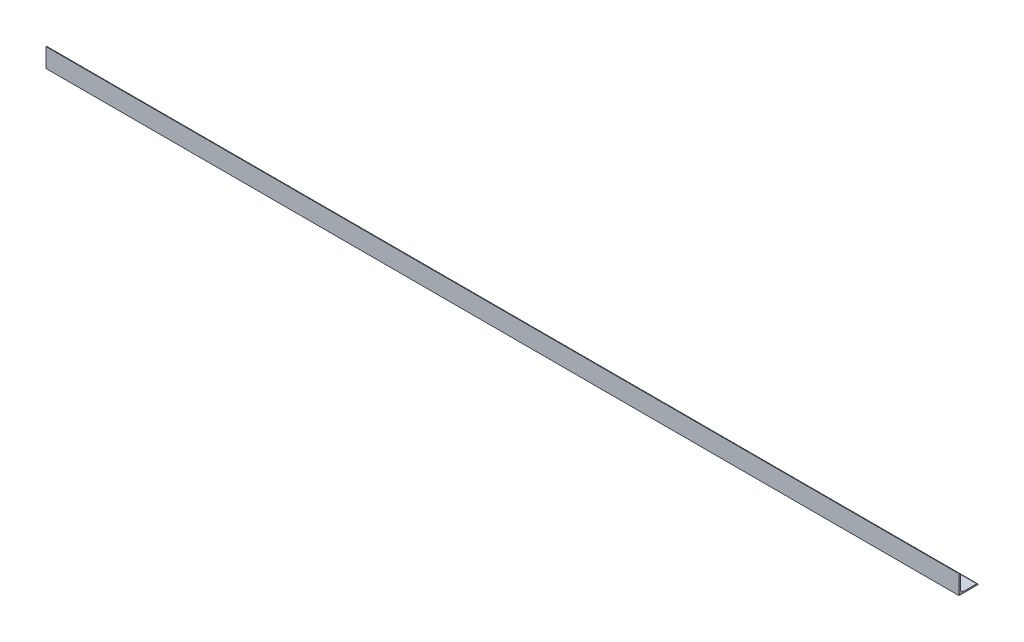
ISO-10303-21;
HEADER;
FILE_DESCRIPTION(('STEP AP214'),'2;1');
FILE_NAME('part.step','',(''),(''),'','','');
FILE_SCHEMA(('AUTOMOTIVE_DESIGN { 1 0 10303 214 1 1 1 1 }'));
ENDSEC;
DATA;
#1=APPLICATION_CONTEXT('core data for automotive mechanical design processes');
#2=APPLICATION_PROTOCOL_DEFINITION('international standard','automotive_design',2000,#1);
#3=PRODUCT_CONTEXT('',#1,'mechanical');
#4=PRODUCT('Part','Part','',(#3));
#5=PRODUCT_RELATED_PRODUCT_CATEGORY('part','',(#4));
#6=PRODUCT_DEFINITION_FORMATION('','',#4);
#7=PRODUCT_DEFINITION_CONTEXT('part definition',#1,'design');
#8=PRODUCT_DEFINITION('design','',#6,#7);
#9=PRODUCT_DEFINITION_SHAPE('','',#8);
#10=(LENGTH_UNIT() NAMED_UNIT(*) SI_UNIT(.MILLI.,.METRE.));
#11=(NAMED_UNIT(*) PLANE_ANGLE_UNIT() SI_UNIT($,.RADIAN.));
#12=(NAMED_UNIT(*) SI_UNIT($,.STERADIAN.) SOLID_ANGLE_UNIT());
#13=UNCERTAINTY_MEASURE_WITH_UNIT(LENGTH_MEASURE(1.E-05),#10,'distance_accuracy_value','');
#14=(GEOMETRIC_REPRESENTATION_CONTEXT(3) GLOBAL_UNCERTAINTY_ASSIGNED_CONTEXT((#13)) GLOBAL_UNIT_ASSIGNED_CONTEXT((#10,
#11,#12)) REPRESENTATION_CONTEXT('',''));
#15=CARTESIAN_POINT('',(0.,0.,0.));
#16=DIRECTION('',(0.,0.,1.));
#17=DIRECTION('',(1.,0.,0.));
#18=AXIS2_PLACEMENT_3D('',#15,#16,#17);
#19=CARTESIAN_POINT('',(1920.,0.,-40.));
#20=DIRECTION('',(0.,1.,0.));
#21=DIRECTION('',(0.,0.,1.));
#22=AXIS2_PLACEMENT_3D('',#19,#20,#21);
#23=PLANE('',#22);
#24=CARTESIAN_POINT('',(1450.,0.,-19.9999999999966));
#25=DIRECTION('',(0.,-1.,0.));
#26=DIRECTION('',(0.,0.,-1.));
#27=AXIS2_PLACEMENT_3D('',#24,#25,#26);
#28=CIRCLE('',#27,1.99999999999989);
#29=CARTESIAN_POINT('',(1450.,0.,-21.9999999999965));
#30=VERTEX_POINT('',#29);
#31=EDGE_CURVE('E208',#30,#30,#28,.T.);
#32=ORIENTED_EDGE('',*,*,#31,.F.);
#33=EDGE_LOOP('',(#32));
#34=FACE_BOUND('',#33,.T.);
#35=CARTESIAN_POINT('',(470.,0.,-20.));
#36=DIRECTION('',(0.,-1.,0.));
#37=DIRECTION('',(0.,0.,-1.));
#38=AXIS2_PLACEMENT_3D('',#35,#36,#37);
#39=CIRCLE('',#38,2.);
#40=CARTESIAN_POINT('',(470.,0.,-22.));
#41=VERTEX_POINT('',#40);
#42=EDGE_CURVE('E212',#41,#41,#39,.T.);
#43=ORIENTED_EDGE('',*,*,#42,.F.);
#44=EDGE_LOOP('',(#43));
#45=FACE_BOUND('',#44,.T.);
#46=CARTESIAN_POINT('',(960.,0.,-20.));
#47=DIRECTION('',(0.,-1.,0.));
#48=DIRECTION('',(0.,0.,-1.));
#49=AXIS2_PLACEMENT_3D('',#46,#47,#48);
#50=CIRCLE('',#49,2.);
#51=CARTESIAN_POINT('',(960.,0.,-22.));
#52=VERTEX_POINT('',#51);
#53=EDGE_CURVE('E178',#52,#52,#50,.T.);
#54=ORIENTED_EDGE('',*,*,#53,.F.);
#55=EDGE_LOOP('',(#54));
#56=FACE_BOUND('',#55,.T.);
#57=DIRECTION('',(0.,0.,-1.));
#58=VECTOR('',#57,1.);
#59=CARTESIAN_POINT('',(0.,0.,-40.));
#60=LINE('',#59,#58);
#61=CARTESIAN_POINT('',(0.,0.,0.));
#62=VERTEX_POINT('',#61);
#63=CARTESIAN_POINT('',(0.,0.,-40.));
#64=VERTEX_POINT('',#63);
#65=EDGE_CURVE('E154',#62,#64,#60,.T.);
#66=ORIENTED_EDGE('',*,*,#65,.T.);
#67=DIRECTION('',(-1.,0.,0.));
#68=VECTOR('',#67,1.);
#69=CARTESIAN_POINT('',(1920.,0.,-40.));
#70=LINE('',#69,#68);
#71=CARTESIAN_POINT('',(1920.,0.,-40.));
#72=VERTEX_POINT('',#71);
#73=EDGE_CURVE('E13',#72,#64,#70,.T.);
#74=ORIENTED_EDGE('',*,*,#73,.F.);
#75=DIRECTION('',(0.,0.,-1.));
#76=VECTOR('',#75,1.);
#77=CARTESIAN_POINT('',(1920.,0.,-40.));
#78=LINE('',#77,#76);
#79=CARTESIAN_POINT('',(1920.,0.,0.));
#80=VERTEX_POINT('',#79);
#81=EDGE_CURVE('E166',#80,#72,#78,.T.);
#82=ORIENTED_EDGE('',*,*,#81,.F.);
#83=DIRECTION('',(-1.,0.,0.));
#84=VECTOR('',#83,1.);
#85=CARTESIAN_POINT('',(1920.,0.,0.));
#86=LINE('',#85,#84);
#87=EDGE_CURVE('E150',#80,#62,#86,.T.);
#88=ORIENTED_EDGE('',*,*,#87,.T.);
#89=EDGE_LOOP('',(#66,#74,#82,#88));
#90=FACE_BOUND('',#89,.T.);
#91=ADVANCED_FACE('F62',(#34,#45,#56,#90),#23,.F.);
#92=CARTESIAN_POINT('',(1920.,0.,-37.));
#93=DIRECTION('',(-1.,0.,0.));
#94=DIRECTION('',(0.,0.,1.));
#95=AXIS2_PLACEMENT_3D('',#92,#93,#94);
#96=CYLINDRICAL_SURFACE('',#95,3.);
#97=CARTESIAN_POINT('',(0.,0.,-37.));
#98=DIRECTION('',(1.,0.,0.));
#99=DIRECTION('',(0.,0.,-1.));
#100=AXIS2_PLACEMENT_3D('',#97,#98,#99);
#101=CIRCLE('',#100,3.);
#102=CARTESIAN_POINT('',(0.,3.,-37.));
#103=VERTEX_POINT('',#102);
#104=EDGE_CURVE('E157',#64,#103,#101,.T.);
#105=ORIENTED_EDGE('',*,*,#104,.T.);
#106=DIRECTION('',(-1.,0.,0.));
#107=VECTOR('',#106,1.);
#108=CARTESIAN_POINT('',(1920.,3.,-37.));
#109=LINE('',#108,#107);
#110=CARTESIAN_POINT('',(1920.,3.,-37.));
#111=VERTEX_POINT('',#110);
#112=EDGE_CURVE('E71',#111,#103,#109,.T.);
#113=ORIENTED_EDGE('',*,*,#112,.F.);
#114=CARTESIAN_POINT('',(1920.,0.,-37.));
#115=DIRECTION('',(1.,0.,0.));
#116=DIRECTION('',(0.,0.,-1.));
#117=AXIS2_PLACEMENT_3D('',#114,#115,#116);
#118=CIRCLE('',#117,3.);
#119=EDGE_CURVE('E120',#72,#111,#118,.T.);
#120=ORIENTED_EDGE('',*,*,#119,.F.);
#121=ORIENTED_EDGE('',*,*,#73,.T.);
#122=EDGE_LOOP('',(#105,#113,#120,#121));
#123=FACE_BOUND('',#122,.T.);
#124=ADVANCED_FACE('F201',(#123),#96,.T.);
#125=CARTESIAN_POINT('',(1920.,3.,-9.));
#126=DIRECTION('',(0.,-1.,0.));
#127=DIRECTION('',(0.,0.,-1.));
#128=AXIS2_PLACEMENT_3D('',#125,#126,#127);
#129=PLANE('',#128);
#130=CARTESIAN_POINT('',(1450.,3.,-19.9999999999966));
#131=DIRECTION('',(0.,-1.,0.));
#132=DIRECTION('',(0.,0.,-1.));
#133=AXIS2_PLACEMENT_3D('',#130,#131,#132);
#134=CIRCLE('',#133,1.99999999999989);
#135=CARTESIAN_POINT('',(1450.,3.,-21.9999999999965));
#136=VERTEX_POINT('',#135);
#137=EDGE_CURVE('E65',#136,#136,#134,.T.);
#138=ORIENTED_EDGE('',*,*,#137,.T.);
#139=EDGE_LOOP('',(#138));
#140=FACE_BOUND('',#139,.T.);
#141=CARTESIAN_POINT('',(470.,3.,-20.));
#142=DIRECTION('',(0.,-1.,0.));
#143=DIRECTION('',(0.,0.,-1.));
#144=AXIS2_PLACEMENT_3D('',#141,#142,#143);
#145=CIRCLE('',#144,2.);
#146=CARTESIAN_POINT('',(470.,3.,-22.));
#147=VERTEX_POINT('',#146);
#148=EDGE_CURVE('E177',#147,#147,#145,.T.);
#149=ORIENTED_EDGE('',*,*,#148,.T.);
#150=EDGE_LOOP('',(#149));
#151=FACE_BOUND('',#150,.T.);
#152=CARTESIAN_POINT('',(960.,3.,-20.));
#153=DIRECTION('',(0.,-1.,0.));
#154=DIRECTION('',(0.,0.,-1.));
#155=AXIS2_PLACEMENT_3D('',#152,#153,#154);
#156=CIRCLE('',#155,2.);
#157=CARTESIAN_POINT('',(960.,3.,-22.));
#158=VERTEX_POINT('',#157);
#159=EDGE_CURVE('E175',#158,#158,#156,.T.);
#160=ORIENTED_EDGE('',*,*,#159,.T.);
#161=EDGE_LOOP('',(#160));
#162=FACE_BOUND('',#161,.T.);
#163=DIRECTION('',(0.,0.,1.));
#164=VECTOR('',#163,1.);
#165=CARTESIAN_POINT('',(0.,3.,-9.));
#166=LINE('',#165,#164);
#167=CARTESIAN_POINT('',(0.,3.,-9.00000000000001));
#168=VERTEX_POINT('',#167);
#169=EDGE_CURVE('E159',#103,#168,#166,.T.);
#170=ORIENTED_EDGE('',*,*,#169,.T.);
#171=DIRECTION('',(-1.,0.,0.));
#172=VECTOR('',#171,1.);
#173=CARTESIAN_POINT('',(1920.,3.,-9.00000000000001));
#174=LINE('',#173,#172);
#175=CARTESIAN_POINT('',(1920.,3.,-9.00000000000001));
#176=VERTEX_POINT('',#175);
#177=EDGE_CURVE('E170',#176,#168,#174,.T.);
#178=ORIENTED_EDGE('',*,*,#177,.F.);
#179=DIRECTION('',(0.,0.,1.));
#180=VECTOR('',#179,1.);
#181=CARTESIAN_POINT('',(1920.,3.,-9.));
#182=LINE('',#181,#180);
#183=EDGE_CURVE('E226',#111,#176,#182,.T.);
#184=ORIENTED_EDGE('',*,*,#183,.F.);
#185=ORIENTED_EDGE('',*,*,#112,.T.);
#186=EDGE_LOOP('',(#170,#178,#184,#185));
#187=FACE_BOUND('',#186,.T.);
#188=ADVANCED_FACE('F185',(#140,#151,#162,#187),#129,.F.);
#189=CARTESIAN_POINT('',(1920.,9.,-9.));
#190=DIRECTION('',(-1.,0.,0.));
#191=DIRECTION('',(0.,0.,1.));
#192=AXIS2_PLACEMENT_3D('',#189,#190,#191);
#193=CYLINDRICAL_SURFACE('',#192,6.);
#194=CARTESIAN_POINT('',(0.,9.,-9.));
#195=DIRECTION('',(-1.,0.,0.));
#196=DIRECTION('',(0.,0.,1.));
#197=AXIS2_PLACEMENT_3D('',#194,#195,#196);
#198=CIRCLE('',#197,6.);
#199=CARTESIAN_POINT('',(0.,9.,-3.));
#200=VERTEX_POINT('',#199);
#201=EDGE_CURVE('E161',#168,#200,#198,.T.);
#202=ORIENTED_EDGE('',*,*,#201,.T.);
#203=DIRECTION('',(-1.,0.,0.));
#204=VECTOR('',#203,1.);
#205=CARTESIAN_POINT('',(1920.,9.,-3.));
#206=LINE('',#205,#204);
#207=CARTESIAN_POINT('',(1920.,9.,-3.));
#208=VERTEX_POINT('',#207);
#209=EDGE_CURVE('E145',#208,#200,#206,.T.);
#210=ORIENTED_EDGE('',*,*,#209,.F.);
#211=CARTESIAN_POINT('',(1920.,9.,-9.));
#212=DIRECTION('',(-1.,0.,0.));
#213=DIRECTION('',(0.,0.,1.));
#214=AXIS2_PLACEMENT_3D('',#211,#212,#213);
#215=CIRCLE('',#214,6.);
#216=EDGE_CURVE('E136',#176,#208,#215,.T.);
#217=ORIENTED_EDGE('',*,*,#216,.F.);
#218=ORIENTED_EDGE('',*,*,#177,.T.);
#219=EDGE_LOOP('',(#202,#210,#217,#218));
#220=FACE_BOUND('',#219,.T.);
#221=ADVANCED_FACE('F240',(#220),#193,.F.);
#222=CARTESIAN_POINT('',(1920.,37.,-3.));
#223=DIRECTION('',(0.,0.,1.));
#224=DIRECTION('',(1.,0.,0.));
#225=AXIS2_PLACEMENT_3D('',#222,#223,#224);
#226=PLANE('',#225);
#227=DIRECTION('',(0.,1.,0.));
#228=VECTOR('',#227,1.);
#229=CARTESIAN_POINT('',(0.,37.,-3.));
#230=LINE('',#229,#228);
#231=CARTESIAN_POINT('',(0.,37.,-3.));
#232=VERTEX_POINT('',#231);
#233=EDGE_CURVE('E144',#200,#232,#230,.T.);
#234=ORIENTED_EDGE('',*,*,#233,.T.);
#235=DIRECTION('',(-1.,0.,0.));
#236=VECTOR('',#235,1.);
#237=CARTESIAN_POINT('',(1920.,37.,-3.));
#238=LINE('',#237,#236);
#239=CARTESIAN_POINT('',(1920.,37.,-3.));
#240=VERTEX_POINT('',#239);
#241=EDGE_CURVE('E141',#240,#232,#238,.T.);
#242=ORIENTED_EDGE('',*,*,#241,.F.);
#243=DIRECTION('',(0.,1.,0.));
#244=VECTOR('',#243,1.);
#245=CARTESIAN_POINT('',(1920.,37.,-3.));
#246=LINE('',#245,#244);
#247=EDGE_CURVE('E130',#208,#240,#246,.T.);
#248=ORIENTED_EDGE('',*,*,#247,.F.);
#249=ORIENTED_EDGE('',*,*,#209,.T.);
#250=EDGE_LOOP('',(#234,#242,#248,#249));
#251=FACE_BOUND('',#250,.T.);
#252=ADVANCED_FACE('F142',(#251),#226,.F.);
#253=CARTESIAN_POINT('',(1920.,37.,0.));
#254=DIRECTION('',(-1.,0.,0.));
#255=DIRECTION('',(0.,0.,1.));
#256=AXIS2_PLACEMENT_3D('',#253,#254,#255);
#257=CYLINDRICAL_SURFACE('',#256,3.);
#258=CARTESIAN_POINT('',(0.,37.,0.));
#259=DIRECTION('',(1.,0.,0.));
#260=DIRECTION('',(0.,0.,-1.));
#261=AXIS2_PLACEMENT_3D('',#258,#259,#260);
#262=CIRCLE('',#261,3.);
#263=CARTESIAN_POINT('',(0.,40.,0.));
#264=VERTEX_POINT('',#263);
#265=EDGE_CURVE('E106',#232,#264,#262,.T.);
#266=ORIENTED_EDGE('',*,*,#265,.T.);
#267=DIRECTION('',(-1.,0.,0.));
#268=VECTOR('',#267,1.);
#269=CARTESIAN_POINT('',(1920.,40.,0.));
#270=LINE('',#269,#268);
#271=CARTESIAN_POINT('',(1920.,40.,0.));
#272=VERTEX_POINT('',#271);
#273=EDGE_CURVE('E146',#272,#264,#270,.T.);
#274=ORIENTED_EDGE('',*,*,#273,.F.);
#275=CARTESIAN_POINT('',(1920.,37.,0.));
#276=DIRECTION('',(1.,0.,0.));
#277=DIRECTION('',(0.,0.,-1.));
#278=AXIS2_PLACEMENT_3D('',#275,#276,#277);
#279=CIRCLE('',#278,3.);
#280=EDGE_CURVE('E134',#240,#272,#279,.T.);
#281=ORIENTED_EDGE('',*,*,#280,.F.);
#282=ORIENTED_EDGE('',*,*,#241,.T.);
#283=EDGE_LOOP('',(#266,#274,#281,#282));
#284=FACE_BOUND('',#283,.T.);
#285=ADVANCED_FACE('F148',(#284),#257,.T.);
#286=CARTESIAN_POINT('',(1920.,40.,0.));
#287=DIRECTION('',(0.,0.,-1.));
#288=DIRECTION('',(-1.,0.,0.));
#289=AXIS2_PLACEMENT_3D('',#286,#287,#288);
#290=PLANE('',#289);
#291=DIRECTION('',(0.,-1.,0.));
#292=VECTOR('',#291,1.);
#293=CARTESIAN_POINT('',(0.,40.,0.));
#294=LINE('',#293,#292);
#295=EDGE_CURVE('E112',#264,#62,#294,.T.);
#296=ORIENTED_EDGE('',*,*,#295,.T.);
#297=ORIENTED_EDGE('',*,*,#87,.F.);
#298=DIRECTION('',(0.,-1.,0.));
#299=VECTOR('',#298,1.);
#300=CARTESIAN_POINT('',(1920.,40.,0.));
#301=LINE('',#300,#299);
#302=EDGE_CURVE('E80',#272,#80,#301,.T.);
#303=ORIENTED_EDGE('',*,*,#302,.F.);
#304=ORIENTED_EDGE('',*,*,#273,.T.);
#305=EDGE_LOOP('',(#296,#297,#303,#304));
#306=FACE_BOUND('',#305,.T.);
#307=ADVANCED_FACE('F252',(#306),#290,.F.);
#308=CARTESIAN_POINT('',(1920.,37.,0.));
#309=DIRECTION('',(1.,0.,0.));
#310=DIRECTION('',(0.,0.,-1.));
#311=AXIS2_PLACEMENT_3D('',#308,#309,#310);
#312=PLANE('',#311);
#313=ORIENTED_EDGE('',*,*,#81,.T.);
#314=ORIENTED_EDGE('',*,*,#119,.T.);
#315=ORIENTED_EDGE('',*,*,#183,.T.);
#316=ORIENTED_EDGE('',*,*,#216,.T.);
#317=ORIENTED_EDGE('',*,*,#247,.T.);
#318=ORIENTED_EDGE('',*,*,#280,.T.);
#319=ORIENTED_EDGE('',*,*,#302,.T.);
#320=EDGE_LOOP('',(#313,#314,#315,#316,#317,#318,#319));
#321=FACE_BOUND('',#320,.T.);
#322=ADVANCED_FACE('F132',(#321),#312,.T.);
#323=CARTESIAN_POINT('',(0.,37.,0.));
#324=DIRECTION('',(1.,0.,0.));
#325=DIRECTION('',(0.,0.,-1.));
#326=AXIS2_PLACEMENT_3D('',#323,#324,#325);
#327=PLANE('',#326);
#328=ORIENTED_EDGE('',*,*,#65,.F.);
#329=ORIENTED_EDGE('',*,*,#295,.F.);
#330=ORIENTED_EDGE('',*,*,#265,.F.);
#331=ORIENTED_EDGE('',*,*,#233,.F.);
#332=ORIENTED_EDGE('',*,*,#201,.F.);
#333=ORIENTED_EDGE('',*,*,#169,.F.);
#334=ORIENTED_EDGE('',*,*,#104,.F.);
#335=EDGE_LOOP('',(#328,#329,#330,#331,#332,#333,#334));
#336=FACE_BOUND('',#335,.T.);
#337=ADVANCED_FACE('F220',(#336),#327,.F.);
#338=CARTESIAN_POINT('',(960.,10.,-20.));
#339=DIRECTION('',(0.,-1.,0.));
#340=DIRECTION('',(0.,0.,-1.));
#341=AXIS2_PLACEMENT_3D('',#338,#339,#340);
#342=CYLINDRICAL_SURFACE('',#341,2.);
#343=ORIENTED_EDGE('',*,*,#53,.T.);
#344=EDGE_LOOP('',(#343));
#345=FACE_BOUND('',#344,.T.);
#346=ORIENTED_EDGE('',*,*,#159,.F.);
#347=EDGE_LOOP('',(#346));
#348=FACE_BOUND('',#347,.T.);
#349=ADVANCED_FACE('F195',(#345,#348),#342,.F.);
#350=CARTESIAN_POINT('',(470.,10.,-20.));
#351=DIRECTION('',(0.,-1.,0.));
#352=DIRECTION('',(0.,0.,-1.));
#353=AXIS2_PLACEMENT_3D('',#350,#351,#352);
#354=CYLINDRICAL_SURFACE('',#353,2.);
#355=ORIENTED_EDGE('',*,*,#42,.T.);
#356=EDGE_LOOP('',(#355));
#357=FACE_BOUND('',#356,.T.);
#358=ORIENTED_EDGE('',*,*,#148,.F.);
#359=EDGE_LOOP('',(#358));
#360=FACE_BOUND('',#359,.T.);
#361=ADVANCED_FACE('F189',(#357,#360),#354,.F.);
#362=CARTESIAN_POINT('',(1450.,10.,-19.9999999999966));
#363=DIRECTION('',(0.,-1.,0.));
#364=DIRECTION('',(0.,0.,-1.));
#365=AXIS2_PLACEMENT_3D('',#362,#363,#364);
#366=CYLINDRICAL_SURFACE('',#365,1.99999999999989);
#367=ORIENTED_EDGE('',*,*,#31,.T.);
#368=EDGE_LOOP('',(#367));
#369=FACE_BOUND('',#368,.T.);
#370=ORIENTED_EDGE('',*,*,#137,.F.);
#371=EDGE_LOOP('',(#370));
#372=FACE_BOUND('',#371,.T.);
#373=ADVANCED_FACE('F187',(#369,#372),#366,.F.);
#374=CLOSED_SHELL('',(#91,#124,#188,#221,#252,#285,#307,#322,#337,#349,#361,#373));
#375=MANIFOLD_SOLID_BREP('B2',#374);
#376=ADVANCED_BREP_SHAPE_REPRESENTATION('',(#18,#375),#14);
#377=SHAPE_DEFINITION_REPRESENTATION(#9,#376);
ENDSEC;
END-ISO-10303-21;
